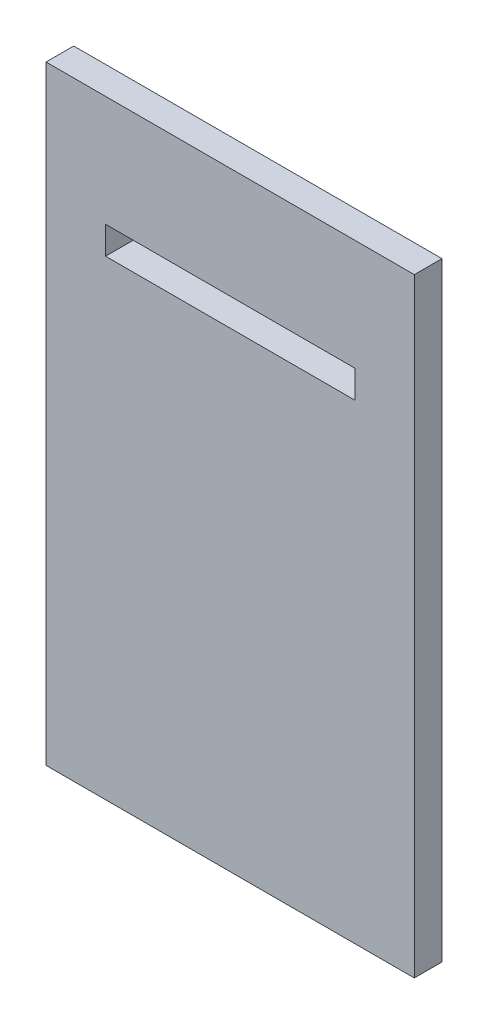
ISO-10303-21;
HEADER;
FILE_DESCRIPTION(('STEP AP214'),'2;1');
FILE_NAME('part.step','',(''),(''),'','','');
FILE_SCHEMA(('AUTOMOTIVE_DESIGN { 1 0 10303 214 1 1 1 1 }'));
ENDSEC;
DATA;
#1=APPLICATION_CONTEXT('core data for automotive mechanical design processes');
#2=APPLICATION_PROTOCOL_DEFINITION('international standard','automotive_design',2000,#1);
#3=PRODUCT_CONTEXT('',#1,'mechanical');
#4=PRODUCT('Part','Part','',(#3));
#5=PRODUCT_RELATED_PRODUCT_CATEGORY('part','',(#4));
#6=PRODUCT_DEFINITION_FORMATION('','',#4);
#7=PRODUCT_DEFINITION_CONTEXT('part definition',#1,'design');
#8=PRODUCT_DEFINITION('design','',#6,#7);
#9=PRODUCT_DEFINITION_SHAPE('','',#8);
#10=(LENGTH_UNIT() NAMED_UNIT(*) SI_UNIT(.MILLI.,.METRE.));
#11=(NAMED_UNIT(*) PLANE_ANGLE_UNIT() SI_UNIT($,.RADIAN.));
#12=(NAMED_UNIT(*) SI_UNIT($,.STERADIAN.) SOLID_ANGLE_UNIT());
#13=UNCERTAINTY_MEASURE_WITH_UNIT(LENGTH_MEASURE(1.E-05),#10,'distance_accuracy_value','');
#14=(GEOMETRIC_REPRESENTATION_CONTEXT(3) GLOBAL_UNCERTAINTY_ASSIGNED_CONTEXT((#13)) GLOBAL_UNIT_ASSIGNED_CONTEXT((#10,
#11,#12)) REPRESENTATION_CONTEXT('',''));
#15=CARTESIAN_POINT('',(0.,0.,0.));
#16=DIRECTION('',(0.,0.,1.));
#17=DIRECTION('',(1.,0.,0.));
#18=AXIS2_PLACEMENT_3D('',#15,#16,#17);
#19=CARTESIAN_POINT('',(0.,0.,10.));
#20=DIRECTION('',(0.,0.,-1.));
#21=DIRECTION('',(-1.,0.,0.));
#22=AXIS2_PLACEMENT_3D('',#19,#20,#21);
#23=PLANE('',#22);
#24=DIRECTION('',(0.,-1.,0.));
#25=VECTOR('',#24,1.);
#26=CARTESIAN_POINT('',(0.,0.,10.));
#27=LINE('',#26,#25);
#28=CARTESIAN_POINT('',(0.,220.,10.));
#29=VERTEX_POINT('',#28);
#30=CARTESIAN_POINT('',(0.,0.,10.));
#31=VERTEX_POINT('',#30);
#32=EDGE_CURVE('E134',#29,#31,#27,.T.);
#33=ORIENTED_EDGE('',*,*,#32,.T.);
#34=DIRECTION('',(1.,0.,0.));
#35=VECTOR('',#34,1.);
#36=CARTESIAN_POINT('',(0.,0.,10.));
#37=LINE('',#36,#35);
#38=CARTESIAN_POINT('',(133.,0.,10.));
#39=VERTEX_POINT('',#38);
#40=EDGE_CURVE('E137',#31,#39,#37,.T.);
#41=ORIENTED_EDGE('',*,*,#40,.T.);
#42=DIRECTION('',(0.,1.,0.));
#43=VECTOR('',#42,1.);
#44=CARTESIAN_POINT('',(133.,0.,10.));
#45=LINE('',#44,#43);
#46=CARTESIAN_POINT('',(133.,220.,10.));
#47=VERTEX_POINT('',#46);
#48=EDGE_CURVE('E140',#39,#47,#45,.T.);
#49=ORIENTED_EDGE('',*,*,#48,.T.);
#50=DIRECTION('',(-1.,0.,0.));
#51=VECTOR('',#50,1.);
#52=CARTESIAN_POINT('',(0.,220.,10.));
#53=LINE('',#52,#51);
#54=EDGE_CURVE('E142',#47,#29,#53,.T.);
#55=ORIENTED_EDGE('',*,*,#54,.T.);
#56=EDGE_LOOP('',(#33,#41,#49,#55));
#57=FACE_BOUND('',#56,.T.);
#58=DIRECTION('',(0.,-1.,0.));
#59=VECTOR('',#58,1.);
#60=CARTESIAN_POINT('',(21.5,180.,10.));
#61=LINE('',#60,#59);
#62=CARTESIAN_POINT('',(21.5,180.,10.));
#63=VERTEX_POINT('',#62);
#64=CARTESIAN_POINT('',(21.5,170.,10.));
#65=VERTEX_POINT('',#64);
#66=EDGE_CURVE('E98',#63,#65,#61,.T.);
#67=ORIENTED_EDGE('',*,*,#66,.F.);
#68=DIRECTION('',(-1.,0.,0.));
#69=VECTOR('',#68,1.);
#70=CARTESIAN_POINT('',(21.5,180.,10.));
#71=LINE('',#70,#69);
#72=CARTESIAN_POINT('',(111.5,180.,10.));
#73=VERTEX_POINT('',#72);
#74=EDGE_CURVE('E120',#73,#63,#71,.T.);
#75=ORIENTED_EDGE('',*,*,#74,.F.);
#76=DIRECTION('',(0.,1.,0.));
#77=VECTOR('',#76,1.);
#78=CARTESIAN_POINT('',(111.5,180.,10.));
#79=LINE('',#78,#77);
#80=CARTESIAN_POINT('',(111.5,170.,10.));
#81=VERTEX_POINT('',#80);
#82=EDGE_CURVE('E118',#81,#73,#79,.T.);
#83=ORIENTED_EDGE('',*,*,#82,.F.);
#84=DIRECTION('',(1.,0.,0.));
#85=VECTOR('',#84,1.);
#86=CARTESIAN_POINT('',(111.5,170.,10.));
#87=LINE('',#86,#85);
#88=EDGE_CURVE('E106',#65,#81,#87,.T.);
#89=ORIENTED_EDGE('',*,*,#88,.F.);
#90=EDGE_LOOP('',(#67,#75,#83,#89));
#91=FACE_BOUND('',#90,.T.);
#92=ADVANCED_FACE('F33',(#57,#91),#23,.F.);
#93=CARTESIAN_POINT('',(0.,0.,0.));
#94=DIRECTION('',(0.,0.,-1.));
#95=DIRECTION('',(-1.,0.,0.));
#96=AXIS2_PLACEMENT_3D('',#93,#94,#95);
#97=PLANE('',#96);
#98=DIRECTION('',(0.,-1.,0.));
#99=VECTOR('',#98,1.);
#100=CARTESIAN_POINT('',(0.,0.,0.));
#101=LINE('',#100,#99);
#102=CARTESIAN_POINT('',(0.,220.,0.));
#103=VERTEX_POINT('',#102);
#104=CARTESIAN_POINT('',(0.,0.,0.));
#105=VERTEX_POINT('',#104);
#106=EDGE_CURVE('E114',#103,#105,#101,.T.);
#107=ORIENTED_EDGE('',*,*,#106,.F.);
#108=DIRECTION('',(-1.,0.,0.));
#109=VECTOR('',#108,1.);
#110=CARTESIAN_POINT('',(0.,220.,0.));
#111=LINE('',#110,#109);
#112=CARTESIAN_POINT('',(133.,220.,0.));
#113=VERTEX_POINT('',#112);
#114=EDGE_CURVE('E138',#113,#103,#111,.T.);
#115=ORIENTED_EDGE('',*,*,#114,.F.);
#116=DIRECTION('',(0.,1.,0.));
#117=VECTOR('',#116,1.);
#118=CARTESIAN_POINT('',(133.,0.,0.));
#119=LINE('',#118,#117);
#120=CARTESIAN_POINT('',(133.,0.,0.));
#121=VERTEX_POINT('',#120);
#122=EDGE_CURVE('E149',#121,#113,#119,.T.);
#123=ORIENTED_EDGE('',*,*,#122,.F.);
#124=DIRECTION('',(1.,0.,0.));
#125=VECTOR('',#124,1.);
#126=CARTESIAN_POINT('',(0.,0.,0.));
#127=LINE('',#126,#125);
#128=EDGE_CURVE('E147',#105,#121,#127,.T.);
#129=ORIENTED_EDGE('',*,*,#128,.F.);
#130=EDGE_LOOP('',(#107,#115,#123,#129));
#131=FACE_BOUND('',#130,.T.);
#132=DIRECTION('',(-1.,0.,0.));
#133=VECTOR('',#132,1.);
#134=CARTESIAN_POINT('',(21.5,180.,0.));
#135=LINE('',#134,#133);
#136=CARTESIAN_POINT('',(111.5,180.,0.));
#137=VERTEX_POINT('',#136);
#138=CARTESIAN_POINT('',(21.5,180.,0.));
#139=VERTEX_POINT('',#138);
#140=EDGE_CURVE('E107',#137,#139,#135,.T.);
#141=ORIENTED_EDGE('',*,*,#140,.T.);
#142=DIRECTION('',(0.,-1.,0.));
#143=VECTOR('',#142,1.);
#144=CARTESIAN_POINT('',(21.5,180.,0.));
#145=LINE('',#144,#143);
#146=CARTESIAN_POINT('',(21.5,170.,0.));
#147=VERTEX_POINT('',#146);
#148=EDGE_CURVE('E56',#139,#147,#145,.T.);
#149=ORIENTED_EDGE('',*,*,#148,.T.);
#150=DIRECTION('',(1.,0.,0.));
#151=VECTOR('',#150,1.);
#152=CARTESIAN_POINT('',(111.5,170.,0.));
#153=LINE('',#152,#151);
#154=CARTESIAN_POINT('',(111.5,170.,0.));
#155=VERTEX_POINT('',#154);
#156=EDGE_CURVE('E113',#147,#155,#153,.T.);
#157=ORIENTED_EDGE('',*,*,#156,.T.);
#158=DIRECTION('',(0.,1.,0.));
#159=VECTOR('',#158,1.);
#160=CARTESIAN_POINT('',(111.5,180.,0.));
#161=LINE('',#160,#159);
#162=EDGE_CURVE('E126',#155,#137,#161,.T.);
#163=ORIENTED_EDGE('',*,*,#162,.T.);
#164=EDGE_LOOP('',(#141,#149,#157,#163));
#165=FACE_BOUND('',#164,.T.);
#166=ADVANCED_FACE('F167',(#131,#165),#97,.T.);
#167=CARTESIAN_POINT('',(0.,0.,10.));
#168=DIRECTION('',(1.,0.,0.));
#169=DIRECTION('',(0.,0.,-1.));
#170=AXIS2_PLACEMENT_3D('',#167,#168,#169);
#171=PLANE('',#170);
#172=ORIENTED_EDGE('',*,*,#106,.T.);
#173=DIRECTION('',(0.,0.,-1.));
#174=VECTOR('',#173,1.);
#175=CARTESIAN_POINT('',(0.,0.,10.));
#176=LINE('',#175,#174);
#177=EDGE_CURVE('E11',#31,#105,#176,.T.);
#178=ORIENTED_EDGE('',*,*,#177,.F.);
#179=ORIENTED_EDGE('',*,*,#32,.F.);
#180=DIRECTION('',(0.,0.,-1.));
#181=VECTOR('',#180,1.);
#182=CARTESIAN_POINT('',(0.,220.,10.));
#183=LINE('',#182,#181);
#184=EDGE_CURVE('E144',#29,#103,#183,.T.);
#185=ORIENTED_EDGE('',*,*,#184,.T.);
#186=EDGE_LOOP('',(#172,#178,#179,#185));
#187=FACE_BOUND('',#186,.T.);
#188=ADVANCED_FACE('F35',(#187),#171,.F.);
#189=CARTESIAN_POINT('',(0.,0.,10.));
#190=DIRECTION('',(0.,1.,0.));
#191=DIRECTION('',(0.,0.,1.));
#192=AXIS2_PLACEMENT_3D('',#189,#190,#191);
#193=PLANE('',#192);
#194=ORIENTED_EDGE('',*,*,#128,.T.);
#195=DIRECTION('',(0.,0.,-1.));
#196=VECTOR('',#195,1.);
#197=CARTESIAN_POINT('',(133.,0.,10.));
#198=LINE('',#197,#196);
#199=EDGE_CURVE('E41',#39,#121,#198,.T.);
#200=ORIENTED_EDGE('',*,*,#199,.F.);
#201=ORIENTED_EDGE('',*,*,#40,.F.);
#202=ORIENTED_EDGE('',*,*,#177,.T.);
#203=EDGE_LOOP('',(#194,#200,#201,#202));
#204=FACE_BOUND('',#203,.T.);
#205=ADVANCED_FACE('F177',(#204),#193,.F.);
#206=CARTESIAN_POINT('',(133.,0.,10.));
#207=DIRECTION('',(-1.,0.,0.));
#208=DIRECTION('',(0.,0.,1.));
#209=AXIS2_PLACEMENT_3D('',#206,#207,#208);
#210=PLANE('',#209);
#211=ORIENTED_EDGE('',*,*,#122,.T.);
#212=DIRECTION('',(0.,0.,-1.));
#213=VECTOR('',#212,1.);
#214=CARTESIAN_POINT('',(133.,220.,10.));
#215=LINE('',#214,#213);
#216=EDGE_CURVE('E154',#47,#113,#215,.T.);
#217=ORIENTED_EDGE('',*,*,#216,.F.);
#218=ORIENTED_EDGE('',*,*,#48,.F.);
#219=ORIENTED_EDGE('',*,*,#199,.T.);
#220=EDGE_LOOP('',(#211,#217,#218,#219));
#221=FACE_BOUND('',#220,.T.);
#222=ADVANCED_FACE('F161',(#221),#210,.F.);
#223=CARTESIAN_POINT('',(0.,220.,10.));
#224=DIRECTION('',(0.,-1.,0.));
#225=DIRECTION('',(0.,0.,-1.));
#226=AXIS2_PLACEMENT_3D('',#223,#224,#225);
#227=PLANE('',#226);
#228=ORIENTED_EDGE('',*,*,#114,.T.);
#229=ORIENTED_EDGE('',*,*,#184,.F.);
#230=ORIENTED_EDGE('',*,*,#54,.F.);
#231=ORIENTED_EDGE('',*,*,#216,.T.);
#232=EDGE_LOOP('',(#228,#229,#230,#231));
#233=FACE_BOUND('',#232,.T.);
#234=ADVANCED_FACE('F171',(#233),#227,.F.);
#235=CARTESIAN_POINT('',(21.5,180.,10.));
#236=DIRECTION('',(1.,0.,0.));
#237=DIRECTION('',(0.,0.,-1.));
#238=AXIS2_PLACEMENT_3D('',#235,#236,#237);
#239=PLANE('',#238);
#240=ORIENTED_EDGE('',*,*,#148,.F.);
#241=DIRECTION('',(0.,0.,-1.));
#242=VECTOR('',#241,1.);
#243=CARTESIAN_POINT('',(21.5,180.,10.));
#244=LINE('',#243,#242);
#245=EDGE_CURVE('E102',#63,#139,#244,.T.);
#246=ORIENTED_EDGE('',*,*,#245,.F.);
#247=ORIENTED_EDGE('',*,*,#66,.T.);
#248=DIRECTION('',(0.,0.,-1.));
#249=VECTOR('',#248,1.);
#250=CARTESIAN_POINT('',(21.5,170.,10.));
#251=LINE('',#250,#249);
#252=EDGE_CURVE('E101',#65,#147,#251,.T.);
#253=ORIENTED_EDGE('',*,*,#252,.T.);
#254=EDGE_LOOP('',(#240,#246,#247,#253));
#255=FACE_BOUND('',#254,.T.);
#256=ADVANCED_FACE('F100',(#255),#239,.T.);
#257=CARTESIAN_POINT('',(111.5,170.,10.));
#258=DIRECTION('',(0.,1.,0.));
#259=DIRECTION('',(0.,0.,1.));
#260=AXIS2_PLACEMENT_3D('',#257,#258,#259);
#261=PLANE('',#260);
#262=ORIENTED_EDGE('',*,*,#156,.F.);
#263=ORIENTED_EDGE('',*,*,#252,.F.);
#264=ORIENTED_EDGE('',*,*,#88,.T.);
#265=DIRECTION('',(0.,0.,-1.));
#266=VECTOR('',#265,1.);
#267=CARTESIAN_POINT('',(111.5,170.,10.));
#268=LINE('',#267,#266);
#269=EDGE_CURVE('E115',#81,#155,#268,.T.);
#270=ORIENTED_EDGE('',*,*,#269,.T.);
#271=EDGE_LOOP('',(#262,#263,#264,#270));
#272=FACE_BOUND('',#271,.T.);
#273=ADVANCED_FACE('F110',(#272),#261,.T.);
#274=CARTESIAN_POINT('',(111.5,180.,10.));
#275=DIRECTION('',(-1.,0.,0.));
#276=DIRECTION('',(0.,0.,1.));
#277=AXIS2_PLACEMENT_3D('',#274,#275,#276);
#278=PLANE('',#277);
#279=ORIENTED_EDGE('',*,*,#162,.F.);
#280=ORIENTED_EDGE('',*,*,#269,.F.);
#281=ORIENTED_EDGE('',*,*,#82,.T.);
#282=DIRECTION('',(0.,0.,-1.));
#283=VECTOR('',#282,1.);
#284=CARTESIAN_POINT('',(111.5,180.,10.));
#285=LINE('',#284,#283);
#286=EDGE_CURVE('E48',#73,#137,#285,.T.);
#287=ORIENTED_EDGE('',*,*,#286,.T.);
#288=EDGE_LOOP('',(#279,#280,#281,#287));
#289=FACE_BOUND('',#288,.T.);
#290=ADVANCED_FACE('F200',(#289),#278,.T.);
#291=CARTESIAN_POINT('',(21.5,180.,10.));
#292=DIRECTION('',(0.,-1.,0.));
#293=DIRECTION('',(0.,0.,-1.));
#294=AXIS2_PLACEMENT_3D('',#291,#292,#293);
#295=PLANE('',#294);
#296=ORIENTED_EDGE('',*,*,#140,.F.);
#297=ORIENTED_EDGE('',*,*,#286,.F.);
#298=ORIENTED_EDGE('',*,*,#74,.T.);
#299=ORIENTED_EDGE('',*,*,#245,.T.);
#300=EDGE_LOOP('',(#296,#297,#298,#299));
#301=FACE_BOUND('',#300,.T.);
#302=ADVANCED_FACE('F204',(#301),#295,.T.);
#303=CLOSED_SHELL('',(#92,#166,#188,#205,#222,#234,#256,#273,#290,#302));
#304=MANIFOLD_SOLID_BREP('B2',#303);
#305=ADVANCED_BREP_SHAPE_REPRESENTATION('',(#18,#304),#14);
#306=SHAPE_DEFINITION_REPRESENTATION(#9,#305);
ENDSEC;
END-ISO-10303-21;
